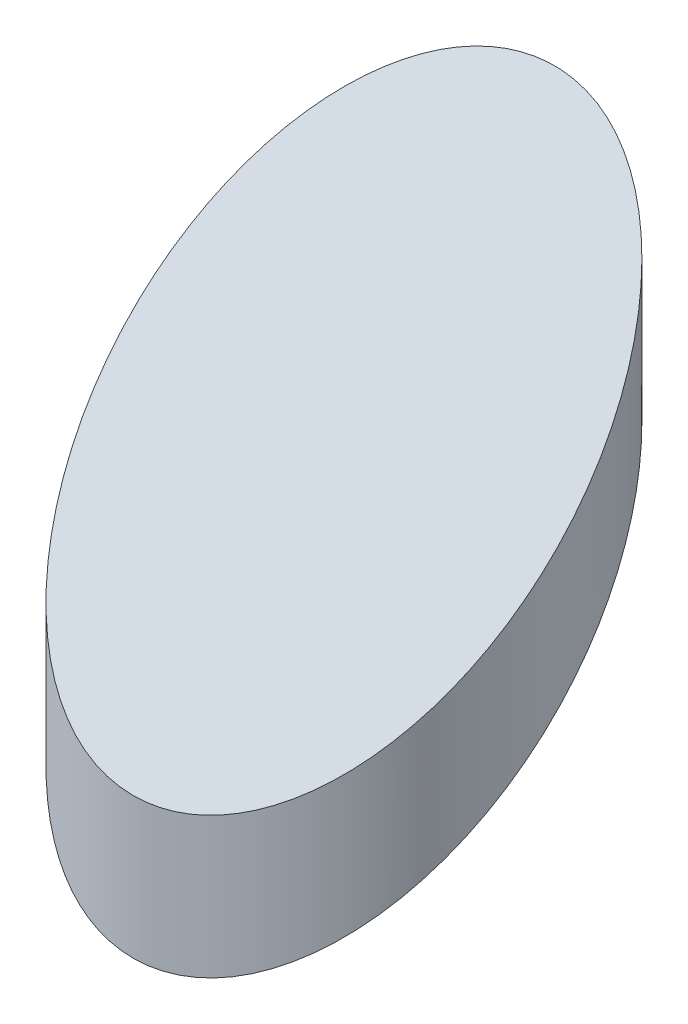
ISO-10303-21;
HEADER;
FILE_DESCRIPTION(('STEP AP214'),'2;1');
FILE_NAME('part.step','',(''),(''),'','','');
FILE_SCHEMA(('AUTOMOTIVE_DESIGN { 1 0 10303 214 1 1 1 1 }'));
ENDSEC;
DATA;
#1=APPLICATION_CONTEXT('core data for automotive mechanical design processes');
#2=APPLICATION_PROTOCOL_DEFINITION('international standard','automotive_design',2000,#1);
#3=PRODUCT_CONTEXT('',#1,'mechanical');
#4=PRODUCT('Part','Part','',(#3));
#5=PRODUCT_RELATED_PRODUCT_CATEGORY('part','',(#4));
#6=PRODUCT_DEFINITION_FORMATION('','',#4);
#7=PRODUCT_DEFINITION_CONTEXT('part definition',#1,'design');
#8=PRODUCT_DEFINITION('design','',#6,#7);
#9=PRODUCT_DEFINITION_SHAPE('','',#8);
#10=(LENGTH_UNIT() NAMED_UNIT(*) SI_UNIT(.MILLI.,.METRE.));
#11=(NAMED_UNIT(*) PLANE_ANGLE_UNIT() SI_UNIT($,.RADIAN.));
#12=(NAMED_UNIT(*) SI_UNIT($,.STERADIAN.) SOLID_ANGLE_UNIT());
#13=UNCERTAINTY_MEASURE_WITH_UNIT(LENGTH_MEASURE(1.E-05),#10,'distance_accuracy_value','');
#14=(GEOMETRIC_REPRESENTATION_CONTEXT(3) GLOBAL_UNCERTAINTY_ASSIGNED_CONTEXT((#13)) GLOBAL_UNIT_ASSIGNED_CONTEXT((#10,
#11,#12)) REPRESENTATION_CONTEXT('',''));
#15=CARTESIAN_POINT('',(0.,0.,0.));
#16=DIRECTION('',(0.,0.,1.));
#17=DIRECTION('',(1.,0.,0.));
#18=AXIS2_PLACEMENT_3D('',#15,#16,#17);
#19=CARTESIAN_POINT('',(0.,80.,0.));
#20=DIRECTION('',(0.,-1.,0.));
#21=DIRECTION('',(0.,0.,-1.));
#22=AXIS2_PLACEMENT_3D('',#19,#20,#21);
#23=CYLINDRICAL_SURFACE('',#22,28.575);
#24=CARTESIAN_POINT('',(0.,28.5750000000003,0.));
#25=DIRECTION('',(0.,0.707106781186544,0.707106781186551));
#26=DIRECTION('',(0.,-0.707106781186551,0.707106781186544));
#27=AXIS2_PLACEMENT_3D('',#24,#25,#26);
#28=ELLIPSE('',#27,40.4111525448114,28.575);
#29=CARTESIAN_POINT('',(0.,0.,28.575));
#30=VERTEX_POINT('',#29);
#31=EDGE_CURVE('E39',#30,#30,#28,.T.);
#32=ORIENTED_EDGE('',*,*,#31,.T.);
#33=EDGE_LOOP('',(#32));
#34=FACE_BOUND('',#33,.T.);
#35=CARTESIAN_POINT('',(0.,47.6849850256356,0.));
#36=DIRECTION('',(0.,-0.707106781186544,-0.707106781186551));
#37=DIRECTION('',(0.,-0.707106781186551,0.707106781186544));
#38=AXIS2_PLACEMENT_3D('',#35,#36,#37);
#39=ELLIPSE('',#38,40.4111525448114,28.575);
#40=CARTESIAN_POINT('',(0.,19.1099850256353,28.575));
#41=VERTEX_POINT('',#40);
#42=EDGE_CURVE('E10',#41,#41,#39,.T.);
#43=ORIENTED_EDGE('',*,*,#42,.T.);
#44=EDGE_LOOP('',(#43));
#45=FACE_BOUND('',#44,.T.);
#46=ADVANCED_FACE('F33',(#34,#45),#23,.T.);
#47=CARTESIAN_POINT('',(-28.575,19.1099850256353,28.575));
#48=DIRECTION('',(0.,-0.707106781186544,-0.707106781186551));
#49=DIRECTION('',(0.,0.707106781186551,-0.707106781186544));
#50=AXIS2_PLACEMENT_3D('',#47,#48,#49);
#51=PLANE('',#50);
#52=ORIENTED_EDGE('',*,*,#42,.F.);
#53=EDGE_LOOP('',(#52));
#54=FACE_BOUND('',#53,.T.);
#55=ADVANCED_FACE('F48',(#54),#51,.F.);
#56=CARTESIAN_POINT('',(-28.575,57.1500000000006,-28.575));
#57=DIRECTION('',(0.,0.707106781186544,0.707106781186551));
#58=DIRECTION('',(0.,-0.707106781186551,0.707106781186544));
#59=AXIS2_PLACEMENT_3D('',#56,#57,#58);
#60=PLANE('',#59);
#61=ORIENTED_EDGE('',*,*,#31,.F.);
#62=EDGE_LOOP('',(#61));
#63=FACE_BOUND('',#62,.T.);
#64=ADVANCED_FACE('F46',(#63),#60,.F.);
#65=CLOSED_SHELL('',(#46,#55,#64));
#66=MANIFOLD_SOLID_BREP('B2',#65);
#67=ADVANCED_BREP_SHAPE_REPRESENTATION('',(#18,#66),#14);
#68=SHAPE_DEFINITION_REPRESENTATION(#9,#67);
ENDSEC;
END-ISO-10303-21;
